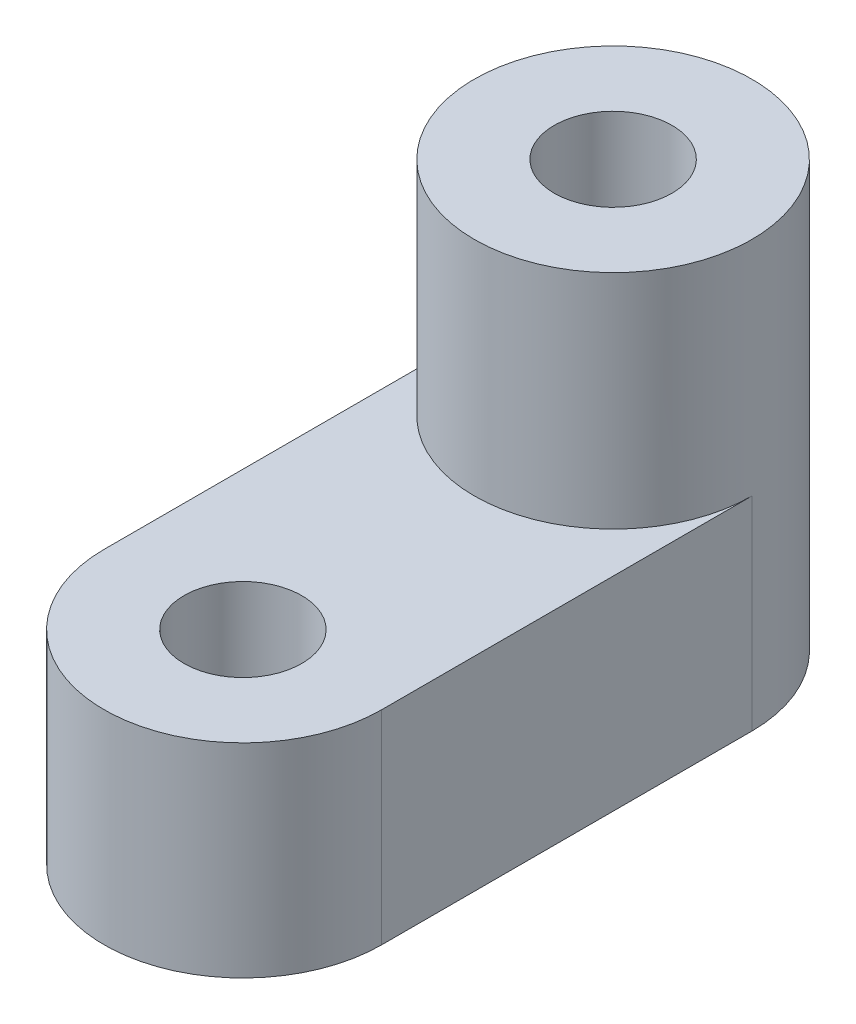
ISO-10303-21;
HEADER;
FILE_DESCRIPTION(('STEP AP214'),'2;1');
FILE_NAME('part.step','',(''),(''),'','','');
FILE_SCHEMA(('AUTOMOTIVE_DESIGN { 1 0 10303 214 1 1 1 1 }'));
ENDSEC;
DATA;
#1=APPLICATION_CONTEXT('core data for automotive mechanical design processes');
#2=APPLICATION_PROTOCOL_DEFINITION('international standard','automotive_design',2000,#1);
#3=PRODUCT_CONTEXT('',#1,'mechanical');
#4=PRODUCT('Part','Part','',(#3));
#5=PRODUCT_RELATED_PRODUCT_CATEGORY('part','',(#4));
#6=PRODUCT_DEFINITION_FORMATION('','',#4);
#7=PRODUCT_DEFINITION_CONTEXT('part definition',#1,'design');
#8=PRODUCT_DEFINITION('design','',#6,#7);
#9=PRODUCT_DEFINITION_SHAPE('','',#8);
#10=(LENGTH_UNIT() NAMED_UNIT(*) SI_UNIT(.MILLI.,.METRE.));
#11=(NAMED_UNIT(*) PLANE_ANGLE_UNIT() SI_UNIT($,.RADIAN.));
#12=(NAMED_UNIT(*) SI_UNIT($,.STERADIAN.) SOLID_ANGLE_UNIT());
#13=UNCERTAINTY_MEASURE_WITH_UNIT(LENGTH_MEASURE(1.E-05),#10,'distance_accuracy_value','');
#14=(GEOMETRIC_REPRESENTATION_CONTEXT(3) GLOBAL_UNCERTAINTY_ASSIGNED_CONTEXT((#13)) GLOBAL_UNIT_ASSIGNED_CONTEXT((#10,
#11,#12)) REPRESENTATION_CONTEXT('',''));
#15=CARTESIAN_POINT('',(0.,0.,0.));
#16=DIRECTION('',(0.,0.,1.));
#17=DIRECTION('',(1.,0.,0.));
#18=AXIS2_PLACEMENT_3D('',#15,#16,#17);
#19=CARTESIAN_POINT('',(3.75,5.5,0.));
#20=DIRECTION('',(-1.,0.,0.));
#21=DIRECTION('',(0.,0.,1.));
#22=AXIS2_PLACEMENT_3D('',#19,#20,#21);
#23=PLANE('',#22);
#24=DIRECTION('',(0.,0.,-1.));
#25=VECTOR('',#24,1.);
#26=CARTESIAN_POINT('',(3.75,0.,0.));
#27=LINE('',#26,#25);
#28=CARTESIAN_POINT('',(3.75,0.,0.));
#29=VERTEX_POINT('',#28);
#30=CARTESIAN_POINT('',(3.75,0.,-9.99999999999999));
#31=VERTEX_POINT('',#30);
#32=EDGE_CURVE('E99',#29,#31,#27,.T.);
#33=ORIENTED_EDGE('',*,*,#32,.T.);
#34=DIRECTION('',(0.,-1.,0.));
#35=VECTOR('',#34,1.);
#36=CARTESIAN_POINT('',(3.75,5.5,-9.99999999999999));
#37=LINE('',#36,#35);
#38=CARTESIAN_POINT('',(3.75,5.5,-9.99999999999999));
#39=VERTEX_POINT('',#38);
#40=EDGE_CURVE('E95',#39,#31,#37,.T.);
#41=ORIENTED_EDGE('',*,*,#40,.F.);
#42=DIRECTION('',(0.,0.,-1.));
#43=VECTOR('',#42,1.);
#44=CARTESIAN_POINT('',(3.75,5.5,0.));
#45=LINE('',#44,#43);
#46=CARTESIAN_POINT('',(3.75,5.5,0.));
#47=VERTEX_POINT('',#46);
#48=EDGE_CURVE('E97',#47,#39,#45,.T.);
#49=ORIENTED_EDGE('',*,*,#48,.F.);
#50=DIRECTION('',(0.,-1.,0.));
#51=VECTOR('',#50,1.);
#52=CARTESIAN_POINT('',(3.75,5.5,0.));
#53=LINE('',#52,#51);
#54=EDGE_CURVE('E59',#47,#29,#53,.T.);
#55=ORIENTED_EDGE('',*,*,#54,.T.);
#56=EDGE_LOOP('',(#33,#41,#49,#55));
#57=FACE_BOUND('',#56,.T.);
#58=ADVANCED_FACE('F50',(#57),#23,.F.);
#59=CARTESIAN_POINT('',(-3.75,5.5,0.));
#60=DIRECTION('',(-1.,0.,0.));
#61=DIRECTION('',(0.,0.,1.));
#62=AXIS2_PLACEMENT_3D('',#59,#60,#61);
#63=PLANE('',#62);
#64=DIRECTION('',(0.,0.,-1.));
#65=VECTOR('',#64,1.);
#66=CARTESIAN_POINT('',(-3.75,0.,0.));
#67=LINE('',#66,#65);
#68=CARTESIAN_POINT('',(-3.75,0.,0.));
#69=VERTEX_POINT('',#68);
#70=CARTESIAN_POINT('',(-3.75,0.,-9.99999999999999));
#71=VERTEX_POINT('',#70);
#72=EDGE_CURVE('E110',#69,#71,#67,.T.);
#73=ORIENTED_EDGE('',*,*,#72,.F.);
#74=DIRECTION('',(0.,-1.,0.));
#75=VECTOR('',#74,1.);
#76=CARTESIAN_POINT('',(-3.75,5.5,0.));
#77=LINE('',#76,#75);
#78=CARTESIAN_POINT('',(-3.75,5.5,0.));
#79=VERTEX_POINT('',#78);
#80=EDGE_CURVE('E67',#79,#69,#77,.T.);
#81=ORIENTED_EDGE('',*,*,#80,.F.);
#82=DIRECTION('',(0.,0.,-1.));
#83=VECTOR('',#82,1.);
#84=CARTESIAN_POINT('',(-3.75,5.5,0.));
#85=LINE('',#84,#83);
#86=CARTESIAN_POINT('',(-3.75,5.5,-9.99999999999999));
#87=VERTEX_POINT('',#86);
#88=EDGE_CURVE('E109',#79,#87,#85,.T.);
#89=ORIENTED_EDGE('',*,*,#88,.T.);
#90=DIRECTION('',(0.,-1.,0.));
#91=VECTOR('',#90,1.);
#92=CARTESIAN_POINT('',(-3.75,5.5,-9.99999999999999));
#93=LINE('',#92,#91);
#94=EDGE_CURVE('E83',#87,#71,#93,.T.);
#95=ORIENTED_EDGE('',*,*,#94,.T.);
#96=EDGE_LOOP('',(#73,#81,#89,#95));
#97=FACE_BOUND('',#96,.T.);
#98=ADVANCED_FACE('F135',(#97),#63,.T.);
#99=CARTESIAN_POINT('',(0.,0.,0.));
#100=DIRECTION('',(0.,1.,0.));
#101=DIRECTION('',(0.,0.,1.));
#102=AXIS2_PLACEMENT_3D('',#99,#100,#101);
#103=PLANE('',#102);
#104=CARTESIAN_POINT('',(0.,0.,0.));
#105=DIRECTION('',(0.,1.,0.));
#106=DIRECTION('',(0.,0.,1.));
#107=AXIS2_PLACEMENT_3D('',#104,#105,#106);
#108=CIRCLE('',#107,1.59);
#109=CARTESIAN_POINT('',(0.,0.,1.59));
#110=VERTEX_POINT('',#109);
#111=EDGE_CURVE('E121',#110,#110,#108,.T.);
#112=ORIENTED_EDGE('',*,*,#111,.T.);
#113=EDGE_LOOP('',(#112));
#114=FACE_BOUND('',#113,.T.);
#115=ORIENTED_EDGE('',*,*,#72,.T.);
#116=CARTESIAN_POINT('',(0.,0.,-10.));
#117=DIRECTION('',(0.,1.,0.));
#118=DIRECTION('',(0.,0.,1.));
#119=AXIS2_PLACEMENT_3D('',#116,#117,#118);
#120=CIRCLE('',#119,3.75);
#121=EDGE_CURVE('E114',#71,#31,#120,.F.);
#122=ORIENTED_EDGE('',*,*,#121,.T.);
#123=ORIENTED_EDGE('',*,*,#32,.F.);
#124=CARTESIAN_POINT('',(0.,0.,0.));
#125=DIRECTION('',(0.,1.,0.));
#126=DIRECTION('',(0.,0.,1.));
#127=AXIS2_PLACEMENT_3D('',#124,#125,#126);
#128=CIRCLE('',#127,3.75);
#129=EDGE_CURVE('E120',#69,#29,#128,.T.);
#130=ORIENTED_EDGE('',*,*,#129,.F.);
#131=EDGE_LOOP('',(#115,#122,#123,#130));
#132=FACE_BOUND('',#131,.T.);
#133=ADVANCED_FACE('F134',(#114,#132),#103,.F.);
#134=CARTESIAN_POINT('',(0.,5.5,0.));
#135=DIRECTION('',(0.,1.,0.));
#136=DIRECTION('',(0.,0.,1.));
#137=AXIS2_PLACEMENT_3D('',#134,#135,#136);
#138=PLANE('',#137);
#139=CARTESIAN_POINT('',(0.,5.5,-10.));
#140=DIRECTION('',(0.,1.,0.));
#141=DIRECTION('',(0.,0.,1.));
#142=AXIS2_PLACEMENT_3D('',#139,#140,#141);
#143=CIRCLE('',#142,3.75);
#144=EDGE_CURVE('E12',#87,#39,#143,.T.);
#145=ORIENTED_EDGE('',*,*,#144,.F.);
#146=ORIENTED_EDGE('',*,*,#88,.F.);
#147=CARTESIAN_POINT('',(0.,5.5,0.));
#148=DIRECTION('',(0.,1.,0.));
#149=DIRECTION('',(0.,0.,1.));
#150=AXIS2_PLACEMENT_3D('',#147,#148,#149);
#151=CIRCLE('',#150,3.75);
#152=EDGE_CURVE('E108',#79,#47,#151,.T.);
#153=ORIENTED_EDGE('',*,*,#152,.T.);
#154=ORIENTED_EDGE('',*,*,#48,.T.);
#155=EDGE_LOOP('',(#145,#146,#153,#154));
#156=FACE_BOUND('',#155,.T.);
#157=CARTESIAN_POINT('',(0.,5.5,0.));
#158=DIRECTION('',(0.,1.,0.));
#159=DIRECTION('',(0.,0.,1.));
#160=AXIS2_PLACEMENT_3D('',#157,#158,#159);
#161=CIRCLE('',#160,1.59);
#162=CARTESIAN_POINT('',(0.,5.5,1.59));
#163=VERTEX_POINT('',#162);
#164=EDGE_CURVE('E123',#163,#163,#161,.T.);
#165=ORIENTED_EDGE('',*,*,#164,.F.);
#166=EDGE_LOOP('',(#165));
#167=FACE_BOUND('',#166,.T.);
#168=ADVANCED_FACE('F105',(#156,#167),#138,.T.);
#169=CARTESIAN_POINT('',(0.,5.5,0.));
#170=DIRECTION('',(0.,-1.,0.));
#171=DIRECTION('',(0.,0.,-1.));
#172=AXIS2_PLACEMENT_3D('',#169,#170,#171);
#173=CYLINDRICAL_SURFACE('',#172,3.75);
#174=ORIENTED_EDGE('',*,*,#129,.T.);
#175=ORIENTED_EDGE('',*,*,#54,.F.);
#176=ORIENTED_EDGE('',*,*,#152,.F.);
#177=ORIENTED_EDGE('',*,*,#80,.T.);
#178=EDGE_LOOP('',(#174,#175,#176,#177));
#179=FACE_BOUND('',#178,.T.);
#180=ADVANCED_FACE('F52',(#179),#173,.T.);
#181=CARTESIAN_POINT('',(0.,0.,0.));
#182=DIRECTION('',(0.,1.,0.));
#183=DIRECTION('',(0.,0.,1.));
#184=AXIS2_PLACEMENT_3D('',#181,#182,#183);
#185=CYLINDRICAL_SURFACE('',#184,1.59);
#186=ORIENTED_EDGE('',*,*,#111,.F.);
#187=EDGE_LOOP('',(#186));
#188=FACE_BOUND('',#187,.T.);
#189=ORIENTED_EDGE('',*,*,#164,.T.);
#190=EDGE_LOOP('',(#189));
#191=FACE_BOUND('',#190,.T.);
#192=ADVANCED_FACE('F146',(#188,#191),#185,.F.);
#193=CARTESIAN_POINT('',(0.,-10.6066017177982,-10.));
#194=DIRECTION('',(0.,1.,0.));
#195=DIRECTION('',(0.,0.,1.));
#196=AXIS2_PLACEMENT_3D('',#193,#194,#195);
#197=CYLINDRICAL_SURFACE('',#196,3.75);
#198=ORIENTED_EDGE('',*,*,#144,.T.);
#199=ORIENTED_EDGE('',*,*,#40,.T.);
#200=ORIENTED_EDGE('',*,*,#121,.F.);
#201=ORIENTED_EDGE('',*,*,#94,.F.);
#202=EDGE_LOOP('',(#198,#199,#200,#201));
#203=FACE_BOUND('',#202,.T.);
#204=CARTESIAN_POINT('',(0.,11.5,-10.));
#205=DIRECTION('',(0.,1.,0.));
#206=DIRECTION('',(0.,0.,1.));
#207=AXIS2_PLACEMENT_3D('',#204,#205,#206);
#208=CIRCLE('',#207,3.75);
#209=CARTESIAN_POINT('',(0.,11.5,-6.25));
#210=VERTEX_POINT('',#209);
#211=EDGE_CURVE('E168',#210,#210,#208,.T.);
#212=ORIENTED_EDGE('',*,*,#211,.F.);
#213=EDGE_LOOP('',(#212));
#214=FACE_BOUND('',#213,.T.);
#215=ADVANCED_FACE('F112',(#203,#214),#197,.T.);
#216=CARTESIAN_POINT('',(0.,11.5,-10.));
#217=DIRECTION('',(0.,1.,0.));
#218=DIRECTION('',(0.,0.,1.));
#219=AXIS2_PLACEMENT_3D('',#216,#217,#218);
#220=PLANE('',#219);
#221=CARTESIAN_POINT('',(0.,11.5,-10.));
#222=DIRECTION('',(0.,1.,0.));
#223=DIRECTION('',(0.,0.,1.));
#224=AXIS2_PLACEMENT_3D('',#221,#222,#223);
#225=CIRCLE('',#224,1.59);
#226=CARTESIAN_POINT('',(0.,11.5,-8.41));
#227=VERTEX_POINT('',#226);
#228=EDGE_CURVE('E169',#227,#227,#225,.T.);
#229=ORIENTED_EDGE('',*,*,#228,.F.);
#230=EDGE_LOOP('',(#229));
#231=FACE_BOUND('',#230,.T.);
#232=ORIENTED_EDGE('',*,*,#211,.T.);
#233=EDGE_LOOP('',(#232));
#234=FACE_BOUND('',#233,.T.);
#235=ADVANCED_FACE('F152',(#231,#234),#220,.T.);
#236=CARTESIAN_POINT('',(0.,1.5,-10.));
#237=DIRECTION('',(0.,1.,0.));
#238=DIRECTION('',(0.,0.,1.));
#239=AXIS2_PLACEMENT_3D('',#236,#237,#238);
#240=CYLINDRICAL_SURFACE('',#239,1.59);
#241=CARTESIAN_POINT('',(0.,1.5,-10.));
#242=DIRECTION('',(0.,1.,0.));
#243=DIRECTION('',(0.,0.,1.));
#244=AXIS2_PLACEMENT_3D('',#241,#242,#243);
#245=CIRCLE('',#244,1.59);
#246=CARTESIAN_POINT('',(0.,1.5,-8.41));
#247=VERTEX_POINT('',#246);
#248=EDGE_CURVE('E167',#247,#247,#245,.T.);
#249=ORIENTED_EDGE('',*,*,#248,.F.);
#250=EDGE_LOOP('',(#249));
#251=FACE_BOUND('',#250,.T.);
#252=ORIENTED_EDGE('',*,*,#228,.T.);
#253=EDGE_LOOP('',(#252));
#254=FACE_BOUND('',#253,.T.);
#255=ADVANCED_FACE('F155',(#251,#254),#240,.F.);
#256=CARTESIAN_POINT('',(0.,1.5,-10.));
#257=DIRECTION('',(0.,1.,0.));
#258=DIRECTION('',(0.,0.,1.));
#259=AXIS2_PLACEMENT_3D('',#256,#257,#258);
#260=PLANE('',#259);
#261=ORIENTED_EDGE('',*,*,#248,.T.);
#262=EDGE_LOOP('',(#261));
#263=FACE_BOUND('',#262,.T.);
#264=ADVANCED_FACE('F159',(#263),#260,.T.);
#265=CLOSED_SHELL('',(#58,#98,#133,#168,#180,#192,#215,#235,#255,#264));
#266=MANIFOLD_SOLID_BREP('B2',#265);
#267=ADVANCED_BREP_SHAPE_REPRESENTATION('',(#18,#266),#14);
#268=SHAPE_DEFINITION_REPRESENTATION(#9,#267);
ENDSEC;
END-ISO-10303-21;
